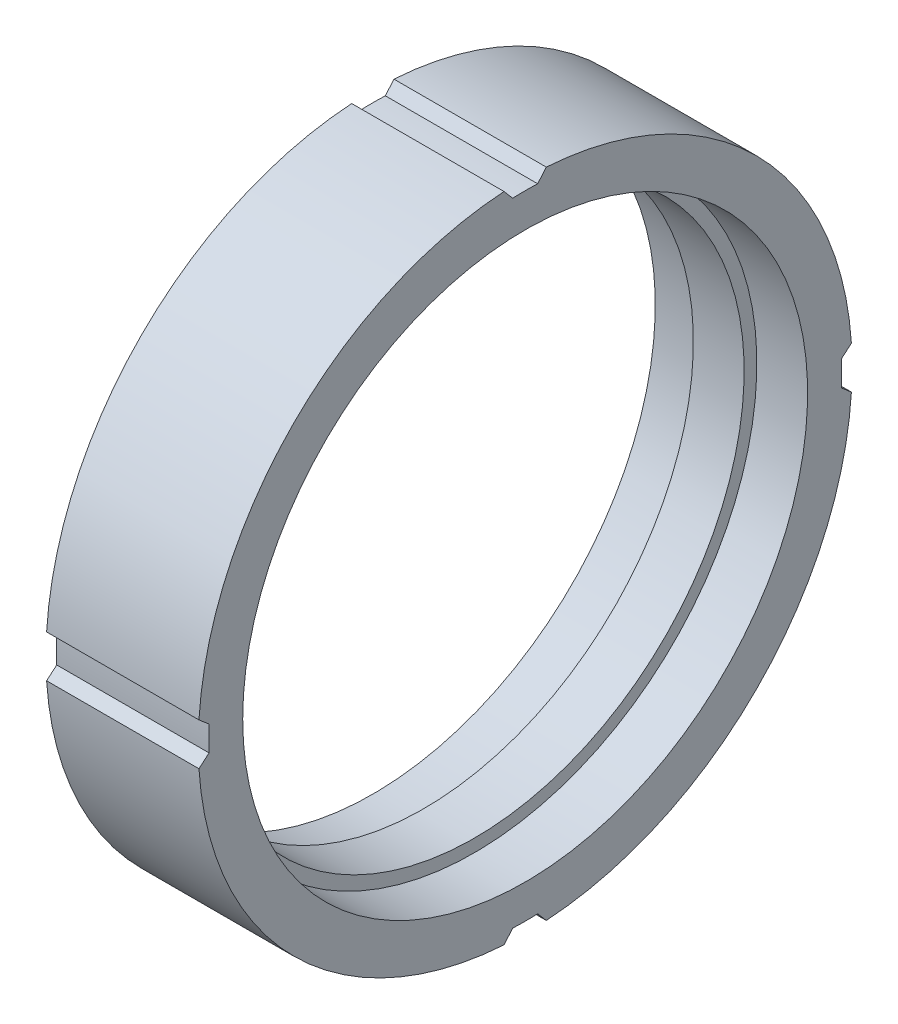
ISO-10303-21;
HEADER;
FILE_DESCRIPTION(('STEP AP214'),'2;1');
FILE_NAME('part.step','',(''),(''),'','','');
FILE_SCHEMA(('AUTOMOTIVE_DESIGN { 1 0 10303 214 1 1 1 1 }'));
ENDSEC;
DATA;
#1=APPLICATION_CONTEXT('core data for automotive mechanical design processes');
#2=APPLICATION_PROTOCOL_DEFINITION('international standard','automotive_design',2000,#1);
#3=PRODUCT_CONTEXT('',#1,'mechanical');
#4=PRODUCT('Part','Part','',(#3));
#5=PRODUCT_RELATED_PRODUCT_CATEGORY('part','',(#4));
#6=PRODUCT_DEFINITION_FORMATION('','',#4);
#7=PRODUCT_DEFINITION_CONTEXT('part definition',#1,'design');
#8=PRODUCT_DEFINITION('design','',#6,#7);
#9=PRODUCT_DEFINITION_SHAPE('','',#8);
#10=(LENGTH_UNIT() NAMED_UNIT(*) SI_UNIT(.MILLI.,.METRE.));
#11=(NAMED_UNIT(*) PLANE_ANGLE_UNIT() SI_UNIT($,.RADIAN.));
#12=(NAMED_UNIT(*) SI_UNIT($,.STERADIAN.) SOLID_ANGLE_UNIT());
#13=UNCERTAINTY_MEASURE_WITH_UNIT(LENGTH_MEASURE(1.E-05),#10,'distance_accuracy_value','');
#14=(GEOMETRIC_REPRESENTATION_CONTEXT(3) GLOBAL_UNCERTAINTY_ASSIGNED_CONTEXT((#13)) GLOBAL_UNIT_ASSIGNED_CONTEXT((#10,
#11,#12)) REPRESENTATION_CONTEXT('',''));
#15=CARTESIAN_POINT('',(0.,0.,0.));
#16=DIRECTION('',(0.,0.,1.));
#17=DIRECTION('',(1.,0.,0.));
#18=AXIS2_PLACEMENT_3D('',#15,#16,#17);
#19=CARTESIAN_POINT('',(-0.622453523883189,0.,0.));
#20=DIRECTION('',(-1.,0.,0.));
#21=DIRECTION('',(0.,0.,1.));
#22=AXIS2_PLACEMENT_3D('',#19,#20,#21);
#23=CYLINDRICAL_SURFACE('',#22,5.15);
#24=CARTESIAN_POINT('',(2.28301092664084,0.,0.));
#25=DIRECTION('',(-1.,0.,0.));
#26=DIRECTION('',(0.,0.,1.));
#27=AXIS2_PLACEMENT_3D('',#24,#25,#26);
#28=CIRCLE('',#27,5.15);
#29=CARTESIAN_POINT('',(2.28301092664084,5.13923066303694,-0.33287864470536));
#30=VERTEX_POINT('',#29);
#31=CARTESIAN_POINT('',(2.28301092664084,0.332878644705256,-5.13923066303696));
#32=VERTEX_POINT('',#31);
#33=EDGE_CURVE('E350',#30,#32,#28,.T.);
#34=ORIENTED_EDGE('',*,*,#33,.T.);
#35=DIRECTION('',(1.,0.,0.));
#36=VECTOR('',#35,1.);
#37=CARTESIAN_POINT('',(-0.116989073359164,0.332878644705256,-5.13923066303696));
#38=LINE('',#37,#36);
#39=CARTESIAN_POINT('',(-0.116989073359164,0.332878644705256,-5.13923066303696));
#40=VERTEX_POINT('',#39);
#41=EDGE_CURVE('E202',#40,#32,#38,.T.);
#42=ORIENTED_EDGE('',*,*,#41,.F.);
#43=CARTESIAN_POINT('',(-0.116989073359164,0.,0.));
#44=DIRECTION('',(-1.,0.,0.));
#45=DIRECTION('',(0.,0.,1.));
#46=AXIS2_PLACEMENT_3D('',#43,#44,#45);
#47=CIRCLE('',#46,5.15);
#48=CARTESIAN_POINT('',(-0.116989073359164,5.13923066303694,-0.33287864470536));
#49=VERTEX_POINT('',#48);
#50=EDGE_CURVE('E348',#49,#40,#47,.T.);
#51=ORIENTED_EDGE('',*,*,#50,.F.);
#52=DIRECTION('',(1.,0.,0.));
#53=VECTOR('',#52,1.);
#54=CARTESIAN_POINT('',(-0.116989073359164,5.13923066303694,-0.33287864470536));
#55=LINE('',#54,#53);
#56=EDGE_CURVE('E236',#49,#30,#55,.T.);
#57=ORIENTED_EDGE('',*,*,#56,.T.);
#58=EDGE_LOOP('',(#34,#42,#51,#57));
#59=FACE_BOUND('',#58,.T.);
#60=ADVANCED_FACE('F50',(#59),#23,.T.);
#61=CARTESIAN_POINT('',(2.28301092664084,0.332878644705326,5.13923066303695));
#62=VERTEX_POINT('',#61);
#63=CARTESIAN_POINT('',(2.28301092664084,5.13923066303695,0.33287864470527));
#64=VERTEX_POINT('',#63);
#65=EDGE_CURVE('E341',#62,#64,#28,.T.);
#66=ORIENTED_EDGE('',*,*,#65,.T.);
#67=DIRECTION('',(1.,0.,0.));
#68=VECTOR('',#67,1.);
#69=CARTESIAN_POINT('',(-0.116989073359164,5.13923066303695,0.33287864470527));
#70=LINE('',#69,#68);
#71=CARTESIAN_POINT('',(-0.116989073359164,5.13923066303695,0.33287864470527));
#72=VERTEX_POINT('',#71);
#73=EDGE_CURVE('E233',#72,#64,#70,.T.);
#74=ORIENTED_EDGE('',*,*,#73,.F.);
#75=CARTESIAN_POINT('',(-0.116989073359164,0.332878644705326,5.13923066303695));
#76=VERTEX_POINT('',#75);
#77=EDGE_CURVE('E59',#76,#72,#47,.T.);
#78=ORIENTED_EDGE('',*,*,#77,.F.);
#79=DIRECTION('',(1.,0.,0.));
#80=VECTOR('',#79,1.);
#81=CARTESIAN_POINT('',(-0.116989073359164,0.332878644705326,5.13923066303695));
#82=LINE('',#81,#80);
#83=EDGE_CURVE('E271',#76,#62,#82,.T.);
#84=ORIENTED_EDGE('',*,*,#83,.T.);
#85=EDGE_LOOP('',(#66,#74,#78,#84));
#86=FACE_BOUND('',#85,.T.);
#87=ADVANCED_FACE('F380',(#86),#23,.T.);
#88=CARTESIAN_POINT('',(2.28301092664084,-5.13923066303694,0.332878644705312));
#89=VERTEX_POINT('',#88);
#90=CARTESIAN_POINT('',(2.28301092664084,-0.332878644705284,5.13923066303693));
#91=VERTEX_POINT('',#90);
#92=EDGE_CURVE('E338',#89,#91,#28,.T.);
#93=ORIENTED_EDGE('',*,*,#92,.T.);
#94=DIRECTION('',(1.,0.,0.));
#95=VECTOR('',#94,1.);
#96=CARTESIAN_POINT('',(-0.116989073359164,-0.332878644705284,5.13923066303693));
#97=LINE('',#96,#95);
#98=CARTESIAN_POINT('',(-0.116989073359164,-0.332878644705284,5.13923066303693));
#99=VERTEX_POINT('',#98);
#100=EDGE_CURVE('E268',#99,#91,#97,.T.);
#101=ORIENTED_EDGE('',*,*,#100,.F.);
#102=CARTESIAN_POINT('',(-0.116989073359164,-5.13923066303694,0.332878644705312));
#103=VERTEX_POINT('',#102);
#104=EDGE_CURVE('E13',#103,#99,#47,.T.);
#105=ORIENTED_EDGE('',*,*,#104,.F.);
#106=DIRECTION('',(1.,0.,0.));
#107=VECTOR('',#106,1.);
#108=CARTESIAN_POINT('',(-0.116989073359164,-5.13923066303694,0.332878644705312));
#109=LINE('',#108,#107);
#110=EDGE_CURVE('E308',#103,#89,#109,.T.);
#111=ORIENTED_EDGE('',*,*,#110,.T.);
#112=EDGE_LOOP('',(#93,#101,#105,#111));
#113=FACE_BOUND('',#112,.T.);
#114=ADVANCED_FACE('F385',(#113),#23,.T.);
#115=CARTESIAN_POINT('',(-0.116989073359164,-4.45000000000002,0.));
#116=DIRECTION('',(1.,0.,0.));
#117=DIRECTION('',(0.,0.,-1.));
#118=AXIS2_PLACEMENT_3D('',#115,#116,#117);
#119=PLANE('',#118);
#120=CARTESIAN_POINT('',(-0.116989073359164,0.,0.));
#121=DIRECTION('',(-1.,0.,0.));
#122=DIRECTION('',(0.,0.,1.));
#123=AXIS2_PLACEMENT_3D('',#120,#121,#122);
#124=CIRCLE('',#123,4.45);
#125=CARTESIAN_POINT('',(-0.116989073359164,0.,4.45));
#126=VERTEX_POINT('',#125);
#127=EDGE_CURVE('E303',#126,#126,#124,.T.);
#128=ORIENTED_EDGE('',*,*,#127,.F.);
#129=EDGE_LOOP('',(#128));
#130=FACE_BOUND('',#129,.T.);
#131=ORIENTED_EDGE('',*,*,#50,.T.);
#132=DIRECTION('',(0.,-0.649237640155618,0.760585620824615));
#133=VECTOR('',#132,1.);
#134=CARTESIAN_POINT('',(-0.116989073359164,0.196837680860956,-4.97985789327843));
#135=LINE('',#134,#133);
#136=CARTESIAN_POINT('',(-0.116989073359164,0.196837680860956,-4.97985789327843));
#137=VERTEX_POINT('',#136);
#138=EDGE_CURVE('E173',#40,#137,#135,.T.);
#139=ORIENTED_EDGE('',*,*,#138,.T.);
#140=CARTESIAN_POINT('',(-0.116989073359164,0.,0.));
#141=DIRECTION('',(-1.,0.,0.));
#142=DIRECTION('',(0.,1.,0.));
#143=AXIS2_PLACEMENT_3D('',#140,#141,#142);
#144=CIRCLE('',#143,4.98374655353321);
#145=CARTESIAN_POINT('',(-0.116989073359164,-0.196837680861067,-4.97985789327841));
#146=VERTEX_POINT('',#145);
#147=EDGE_CURVE('E167',#137,#146,#144,.T.);
#148=ORIENTED_EDGE('',*,*,#147,.T.);
#149=DIRECTION('',(0.,-0.649237640155634,-0.760585620824602));
#150=VECTOR('',#149,1.);
#151=CARTESIAN_POINT('',(-0.116989073359164,-0.196837680861067,-4.97985789327841));
#152=LINE('',#151,#150);
#153=CARTESIAN_POINT('',(-0.116989073359164,-0.332878644705367,-5.13923066303694));
#154=VERTEX_POINT('',#153);
#155=EDGE_CURVE('E176',#146,#154,#152,.T.);
#156=ORIENTED_EDGE('',*,*,#155,.T.);
#157=CARTESIAN_POINT('',(-0.116989073359164,-5.13923066303694,-0.332878644705305));
#158=VERTEX_POINT('',#157);
#159=EDGE_CURVE('E60',#154,#158,#47,.T.);
#160=ORIENTED_EDGE('',*,*,#159,.T.);
#161=DIRECTION('',(0.,0.760585620824608,0.649237640155626));
#162=VECTOR('',#161,1.);
#163=CARTESIAN_POINT('',(-0.116989073359164,-4.97985789327842,-0.196837680861012));
#164=LINE('',#163,#162);
#165=CARTESIAN_POINT('',(-0.116989073359164,-4.97985789327842,-0.196837680861012));
#166=VERTEX_POINT('',#165);
#167=EDGE_CURVE('E287',#158,#166,#164,.T.);
#168=ORIENTED_EDGE('',*,*,#167,.T.);
#169=CARTESIAN_POINT('',(-0.116989073359164,0.,0.));
#170=DIRECTION('',(-1.,0.,0.));
#171=DIRECTION('',(0.,0.,-1.));
#172=AXIS2_PLACEMENT_3D('',#169,#170,#171);
#173=CIRCLE('',#172,4.98374655353321);
#174=CARTESIAN_POINT('',(-0.116989073359164,-4.97985789327843,0.196837680860998));
#175=VERTEX_POINT('',#174);
#176=EDGE_CURVE('E278',#166,#175,#173,.T.);
#177=ORIENTED_EDGE('',*,*,#176,.T.);
#178=DIRECTION('',(0.,-0.760585620824608,0.649237640155626));
#179=VECTOR('',#178,1.);
#180=CARTESIAN_POINT('',(-0.116989073359164,-4.97985789327843,0.196837680860998));
#181=LINE('',#180,#179);
#182=EDGE_CURVE('E282',#175,#103,#181,.T.);
#183=ORIENTED_EDGE('',*,*,#182,.T.);
#184=ORIENTED_EDGE('',*,*,#104,.T.);
#185=DIRECTION('',(0.,0.649237640155623,-0.76058562082461));
#186=VECTOR('',#185,1.);
#187=CARTESIAN_POINT('',(-0.116989073359164,-0.196837680860998,4.97985789327842));
#188=LINE('',#187,#186);
#189=CARTESIAN_POINT('',(-0.116989073359164,-0.196837680860998,4.97985789327842));
#190=VERTEX_POINT('',#189);
#191=EDGE_CURVE('E251',#99,#190,#188,.T.);
#192=ORIENTED_EDGE('',*,*,#191,.T.);
#193=CARTESIAN_POINT('',(-0.116989073359164,0.,0.));
#194=DIRECTION('',(-1.,0.,0.));
#195=DIRECTION('',(0.,-1.,0.));
#196=AXIS2_PLACEMENT_3D('',#193,#194,#195);
#197=CIRCLE('',#196,4.98374655353321);
#198=CARTESIAN_POINT('',(-0.116989073359164,0.196837680861039,4.97985789327842));
#199=VERTEX_POINT('',#198);
#200=EDGE_CURVE('E242',#190,#199,#197,.T.);
#201=ORIENTED_EDGE('',*,*,#200,.T.);
#202=DIRECTION('',(0.,0.649237640155629,0.760585620824606));
#203=VECTOR('',#202,1.);
#204=CARTESIAN_POINT('',(-0.116989073359164,0.196837680861039,4.97985789327842));
#205=LINE('',#204,#203);
#206=EDGE_CURVE('E246',#199,#76,#205,.T.);
#207=ORIENTED_EDGE('',*,*,#206,.T.);
#208=ORIENTED_EDGE('',*,*,#77,.T.);
#209=DIRECTION('',(0.,-0.760585620824613,-0.649237640155621));
#210=VECTOR('',#209,1.);
#211=CARTESIAN_POINT('',(-0.116989073359164,4.97985789327844,0.196837680860977));
#212=LINE('',#211,#210);
#213=CARTESIAN_POINT('',(-0.116989073359164,4.97985789327844,0.196837680860977));
#214=VERTEX_POINT('',#213);
#215=EDGE_CURVE('E216',#72,#214,#212,.T.);
#216=ORIENTED_EDGE('',*,*,#215,.T.);
#217=CARTESIAN_POINT('',(-0.116989073359164,0.,0.));
#218=DIRECTION('',(-1.,0.,0.));
#219=DIRECTION('',(0.,0.,1.));
#220=AXIS2_PLACEMENT_3D('',#217,#218,#219);
#221=CIRCLE('',#220,4.98374655353321);
#222=CARTESIAN_POINT('',(-0.116989073359164,4.97985789327841,-0.196837680861046));
#223=VERTEX_POINT('',#222);
#224=EDGE_CURVE('E207',#214,#223,#221,.T.);
#225=ORIENTED_EDGE('',*,*,#224,.T.);
#226=DIRECTION('',(0.,0.760585620824604,-0.649237640155631));
#227=VECTOR('',#226,1.);
#228=CARTESIAN_POINT('',(-0.116989073359164,4.97985789327841,-0.196837680861046));
#229=LINE('',#228,#227);
#230=EDGE_CURVE('E211',#223,#49,#229,.T.);
#231=ORIENTED_EDGE('',*,*,#230,.T.);
#232=EDGE_LOOP('',(#131,#139,#148,#156,#160,#168,#177,#183,#184,#192,#201,#207,#208,#216,#225,#231));
#233=FACE_BOUND('',#232,.T.);
#234=ADVANCED_FACE('F52',(#130,#233),#119,.F.);
#235=ORIENTED_EDGE('',*,*,#159,.F.);
#236=DIRECTION('',(1.,0.,0.));
#237=VECTOR('',#236,1.);
#238=CARTESIAN_POINT('',(-0.116989073359164,-0.332878644705367,-5.13923066303694));
#239=LINE('',#238,#237);
#240=CARTESIAN_POINT('',(2.28301092664084,-0.332878644705367,-5.13923066303694));
#241=VERTEX_POINT('',#240);
#242=EDGE_CURVE('E172',#154,#241,#239,.T.);
#243=ORIENTED_EDGE('',*,*,#242,.T.);
#244=CARTESIAN_POINT('',(2.28301092664084,-5.13923066303694,-0.332878644705305));
#245=VERTEX_POINT('',#244);
#246=EDGE_CURVE('E337',#241,#245,#28,.T.);
#247=ORIENTED_EDGE('',*,*,#246,.T.);
#248=DIRECTION('',(1.,0.,0.));
#249=VECTOR('',#248,1.);
#250=CARTESIAN_POINT('',(-0.116989073359164,-5.13923066303694,-0.332878644705305));
#251=LINE('',#250,#249);
#252=EDGE_CURVE('E304',#158,#245,#251,.T.);
#253=ORIENTED_EDGE('',*,*,#252,.F.);
#254=EDGE_LOOP('',(#235,#243,#247,#253));
#255=FACE_BOUND('',#254,.T.);
#256=ADVANCED_FACE('F381',(#255),#23,.T.);
#257=CARTESIAN_POINT('',(2.28301092664084,-5.15,0.));
#258=DIRECTION('',(-1.,0.,0.));
#259=DIRECTION('',(0.,0.,1.));
#260=AXIS2_PLACEMENT_3D('',#257,#258,#259);
#261=PLANE('',#260);
#262=CARTESIAN_POINT('',(2.28301092664084,0.,0.));
#263=DIRECTION('',(-1.,0.,0.));
#264=DIRECTION('',(0.,1.,0.));
#265=AXIS2_PLACEMENT_3D('',#262,#263,#264);
#266=CIRCLE('',#265,4.98374655353321);
#267=CARTESIAN_POINT('',(2.28301092664084,0.196837680860956,-4.97985789327843));
#268=VERTEX_POINT('',#267);
#269=CARTESIAN_POINT('',(2.28301092664084,-0.196837680861067,-4.97985789327841));
#270=VERTEX_POINT('',#269);
#271=EDGE_CURVE('E67',#268,#270,#266,.T.);
#272=ORIENTED_EDGE('',*,*,#271,.F.);
#273=DIRECTION('',(0.,-0.649237640155618,0.760585620824615));
#274=VECTOR('',#273,1.);
#275=CARTESIAN_POINT('',(2.28301092664084,0.196837680860956,-4.97985789327843));
#276=LINE('',#275,#274);
#277=EDGE_CURVE('E185',#32,#268,#276,.T.);
#278=ORIENTED_EDGE('',*,*,#277,.F.);
#279=ORIENTED_EDGE('',*,*,#33,.F.);
#280=DIRECTION('',(0.,0.760585620824604,-0.649237640155631));
#281=VECTOR('',#280,1.);
#282=CARTESIAN_POINT('',(2.28301092664084,4.97985789327841,-0.196837680861046));
#283=LINE('',#282,#281);
#284=CARTESIAN_POINT('',(2.28301092664084,4.97985789327841,-0.19683768086106));
#285=VERTEX_POINT('',#284);
#286=EDGE_CURVE('E223',#285,#30,#283,.T.);
#287=ORIENTED_EDGE('',*,*,#286,.F.);
#288=CARTESIAN_POINT('',(2.28301092664084,0.,0.));
#289=DIRECTION('',(-1.,0.,0.));
#290=DIRECTION('',(0.,0.,1.));
#291=AXIS2_PLACEMENT_3D('',#288,#289,#290);
#292=CIRCLE('',#291,4.98374655353321);
#293=CARTESIAN_POINT('',(2.28301092664084,4.97985789327843,0.196837680860977));
#294=VERTEX_POINT('',#293);
#295=EDGE_CURVE('E75',#294,#285,#292,.T.);
#296=ORIENTED_EDGE('',*,*,#295,.F.);
#297=DIRECTION('',(0.,-0.760585620824613,-0.649237640155621));
#298=VECTOR('',#297,1.);
#299=CARTESIAN_POINT('',(2.28301092664084,4.97985789327843,0.196837680860977));
#300=LINE('',#299,#298);
#301=EDGE_CURVE('E212',#64,#294,#300,.T.);
#302=ORIENTED_EDGE('',*,*,#301,.F.);
#303=ORIENTED_EDGE('',*,*,#65,.F.);
#304=DIRECTION('',(0.,0.649237640155629,0.760585620824606));
#305=VECTOR('',#304,1.);
#306=CARTESIAN_POINT('',(2.28301092664084,0.196837680861026,4.97985789327842));
#307=LINE('',#306,#305);
#308=CARTESIAN_POINT('',(2.28301092664084,0.196837680861039,4.97985789327842));
#309=VERTEX_POINT('',#308);
#310=EDGE_CURVE('E258',#309,#62,#307,.T.);
#311=ORIENTED_EDGE('',*,*,#310,.F.);
#312=CARTESIAN_POINT('',(2.28301092664084,0.,0.));
#313=DIRECTION('',(-1.,0.,0.));
#314=DIRECTION('',(0.,-1.,0.));
#315=AXIS2_PLACEMENT_3D('',#312,#313,#314);
#316=CIRCLE('',#315,4.98374655353321);
#317=CARTESIAN_POINT('',(2.28301092664084,-0.196837680860998,4.97985789327842));
#318=VERTEX_POINT('',#317);
#319=EDGE_CURVE('E232',#318,#309,#316,.T.);
#320=ORIENTED_EDGE('',*,*,#319,.F.);
#321=DIRECTION('',(0.,0.649237640155623,-0.76058562082461));
#322=VECTOR('',#321,1.);
#323=CARTESIAN_POINT('',(2.28301092664084,-0.196837680860998,4.97985789327842));
#324=LINE('',#323,#322);
#325=EDGE_CURVE('E247',#91,#318,#324,.T.);
#326=ORIENTED_EDGE('',*,*,#325,.F.);
#327=ORIENTED_EDGE('',*,*,#92,.F.);
#328=DIRECTION('',(0.,-0.760585620824608,0.649237640155626));
#329=VECTOR('',#328,1.);
#330=CARTESIAN_POINT('',(2.28301092664084,-4.97985789327843,0.196837680860998));
#331=LINE('',#330,#329);
#332=CARTESIAN_POINT('',(2.28301092664084,-4.97985789327843,0.196837680860998));
#333=VERTEX_POINT('',#332);
#334=EDGE_CURVE('E294',#333,#89,#331,.T.);
#335=ORIENTED_EDGE('',*,*,#334,.F.);
#336=CARTESIAN_POINT('',(2.28301092664084,0.,0.));
#337=DIRECTION('',(-1.,0.,0.));
#338=DIRECTION('',(0.,0.,-1.));
#339=AXIS2_PLACEMENT_3D('',#336,#337,#338);
#340=CIRCLE('',#339,4.98374655353321);
#341=CARTESIAN_POINT('',(2.28301092664084,-4.97985789327842,-0.196837680861012));
#342=VERTEX_POINT('',#341);
#343=EDGE_CURVE('E267',#342,#333,#340,.T.);
#344=ORIENTED_EDGE('',*,*,#343,.F.);
#345=DIRECTION('',(0.,0.760585620824608,0.649237640155626));
#346=VECTOR('',#345,1.);
#347=CARTESIAN_POINT('',(2.28301092664084,-4.97985789327842,-0.196837680861012));
#348=LINE('',#347,#346);
#349=EDGE_CURVE('E283',#245,#342,#348,.T.);
#350=ORIENTED_EDGE('',*,*,#349,.F.);
#351=ORIENTED_EDGE('',*,*,#246,.F.);
#352=DIRECTION('',(0.,-0.649237640155634,-0.760585620824602));
#353=VECTOR('',#352,1.);
#354=CARTESIAN_POINT('',(2.28301092664084,-0.196837680861067,-4.97985789327841));
#355=LINE('',#354,#353);
#356=EDGE_CURVE('E190',#270,#241,#355,.T.);
#357=ORIENTED_EDGE('',*,*,#356,.F.);
#358=EDGE_LOOP('',(#272,#278,#279,#287,#296,#302,#303,#311,#320,#326,#327,#335,#344,#350,#351,#357));
#359=FACE_BOUND('',#358,.T.);
#360=CARTESIAN_POINT('',(2.28301092664084,0.,0.));
#361=DIRECTION('',(-1.,0.,0.));
#362=DIRECTION('',(0.,0.,1.));
#363=AXIS2_PLACEMENT_3D('',#360,#361,#362);
#364=CIRCLE('',#363,4.45);
#365=CARTESIAN_POINT('',(2.28301092664084,0.,4.45));
#366=VERTEX_POINT('',#365);
#367=EDGE_CURVE('E334',#366,#366,#364,.T.);
#368=ORIENTED_EDGE('',*,*,#367,.T.);
#369=EDGE_LOOP('',(#368));
#370=FACE_BOUND('',#369,.T.);
#371=ADVANCED_FACE('F366',(#359,#370),#261,.F.);
#372=CARTESIAN_POINT('',(-0.622453523883189,0.,0.));
#373=DIRECTION('',(-1.,0.,0.));
#374=DIRECTION('',(0.,0.,1.));
#375=AXIS2_PLACEMENT_3D('',#372,#373,#374);
#376=CYLINDRICAL_SURFACE('',#375,4.45);
#377=ORIENTED_EDGE('',*,*,#367,.F.);
#378=EDGE_LOOP('',(#377));
#379=FACE_BOUND('',#378,.T.);
#380=CARTESIAN_POINT('',(1.48301092664083,0.,0.));
#381=DIRECTION('',(-1.,0.,0.));
#382=DIRECTION('',(0.,0.,1.));
#383=AXIS2_PLACEMENT_3D('',#380,#381,#382);
#384=CIRCLE('',#383,4.45);
#385=CARTESIAN_POINT('',(1.48301092664083,0.,4.45));
#386=VERTEX_POINT('',#385);
#387=EDGE_CURVE('E330',#386,#386,#384,.T.);
#388=ORIENTED_EDGE('',*,*,#387,.T.);
#389=EDGE_LOOP('',(#388));
#390=FACE_BOUND('',#389,.T.);
#391=ADVANCED_FACE('F393',(#379,#390),#376,.F.);
#392=CARTESIAN_POINT('',(1.48301092664083,-4.45000000000002,0.));
#393=DIRECTION('',(-1.,0.,0.));
#394=DIRECTION('',(0.,0.,1.));
#395=AXIS2_PLACEMENT_3D('',#392,#393,#394);
#396=PLANE('',#395);
#397=ORIENTED_EDGE('',*,*,#387,.F.);
#398=EDGE_LOOP('',(#397));
#399=FACE_BOUND('',#398,.T.);
#400=CARTESIAN_POINT('',(1.48301092664083,0.,0.));
#401=DIRECTION('',(-1.,0.,0.));
#402=DIRECTION('',(0.,0.,1.));
#403=AXIS2_PLACEMENT_3D('',#400,#401,#402);
#404=CIRCLE('',#403,4.25);
#405=CARTESIAN_POINT('',(1.48301092664083,0.,4.25));
#406=VERTEX_POINT('',#405);
#407=EDGE_CURVE('E326',#406,#406,#404,.T.);
#408=ORIENTED_EDGE('',*,*,#407,.T.);
#409=EDGE_LOOP('',(#408));
#410=FACE_BOUND('',#409,.T.);
#411=ADVANCED_FACE('F423',(#399,#410),#396,.F.);
#412=CARTESIAN_POINT('',(-0.622453523883189,0.,0.));
#413=DIRECTION('',(-1.,0.,0.));
#414=DIRECTION('',(0.,0.,1.));
#415=AXIS2_PLACEMENT_3D('',#412,#413,#414);
#416=CYLINDRICAL_SURFACE('',#415,4.25);
#417=ORIENTED_EDGE('',*,*,#407,.F.);
#418=EDGE_LOOP('',(#417));
#419=FACE_BOUND('',#418,.T.);
#420=CARTESIAN_POINT('',(0.683010926640838,0.,0.));
#421=DIRECTION('',(-1.,0.,0.));
#422=DIRECTION('',(0.,0.,1.));
#423=AXIS2_PLACEMENT_3D('',#420,#421,#422);
#424=CIRCLE('',#423,4.25);
#425=CARTESIAN_POINT('',(0.683010926640838,0.,4.25));
#426=VERTEX_POINT('',#425);
#427=EDGE_CURVE('E322',#426,#426,#424,.T.);
#428=ORIENTED_EDGE('',*,*,#427,.T.);
#429=EDGE_LOOP('',(#428));
#430=FACE_BOUND('',#429,.T.);
#431=ADVANCED_FACE('F433',(#419,#430),#416,.F.);
#432=CARTESIAN_POINT('',(0.683010926640838,-4.25,0.));
#433=DIRECTION('',(1.,0.,0.));
#434=DIRECTION('',(0.,0.,-1.));
#435=AXIS2_PLACEMENT_3D('',#432,#433,#434);
#436=PLANE('',#435);
#437=ORIENTED_EDGE('',*,*,#427,.F.);
#438=EDGE_LOOP('',(#437));
#439=FACE_BOUND('',#438,.T.);
#440=CARTESIAN_POINT('',(0.683010926640838,0.,0.));
#441=DIRECTION('',(-1.,0.,0.));
#442=DIRECTION('',(0.,0.,1.));
#443=AXIS2_PLACEMENT_3D('',#440,#441,#442);
#444=CIRCLE('',#443,4.45);
#445=CARTESIAN_POINT('',(0.683010926640838,0.,4.45));
#446=VERTEX_POINT('',#445);
#447=EDGE_CURVE('E318',#446,#446,#444,.T.);
#448=ORIENTED_EDGE('',*,*,#447,.T.);
#449=EDGE_LOOP('',(#448));
#450=FACE_BOUND('',#449,.T.);
#451=ADVANCED_FACE('F443',(#439,#450),#436,.F.);
#452=CARTESIAN_POINT('',(-0.622453523883189,0.,0.));
#453=DIRECTION('',(-1.,0.,0.));
#454=DIRECTION('',(0.,0.,1.));
#455=AXIS2_PLACEMENT_3D('',#452,#453,#454);
#456=CYLINDRICAL_SURFACE('',#455,4.45);
#457=ORIENTED_EDGE('',*,*,#447,.F.);
#458=EDGE_LOOP('',(#457));
#459=FACE_BOUND('',#458,.T.);
#460=ORIENTED_EDGE('',*,*,#127,.T.);
#461=EDGE_LOOP('',(#460));
#462=FACE_BOUND('',#461,.T.);
#463=ADVANCED_FACE('F453',(#459,#462),#456,.F.);
#464=CARTESIAN_POINT('',(-0.116989073359164,0.,0.));
#465=DIRECTION('',(1.,0.,0.));
#466=DIRECTION('',(0.,0.,-1.));
#467=AXIS2_PLACEMENT_3D('',#464,#465,#466);
#468=CYLINDRICAL_SURFACE('',#467,4.98374655353321);
#469=ORIENTED_EDGE('',*,*,#343,.T.);
#470=DIRECTION('',(1.,0.,0.));
#471=VECTOR('',#470,1.);
#472=CARTESIAN_POINT('',(-0.116989073359164,-4.97985789327843,0.196837680860998));
#473=LINE('',#472,#471);
#474=EDGE_CURVE('E291',#175,#333,#473,.T.);
#475=ORIENTED_EDGE('',*,*,#474,.F.);
#476=ORIENTED_EDGE('',*,*,#176,.F.);
#477=DIRECTION('',(1.,0.,0.));
#478=VECTOR('',#477,1.);
#479=CARTESIAN_POINT('',(-0.116989073359164,-4.97985789327842,-0.196837680861012));
#480=LINE('',#479,#478);
#481=EDGE_CURVE('E300',#166,#342,#480,.T.);
#482=ORIENTED_EDGE('',*,*,#481,.T.);
#483=EDGE_LOOP('',(#469,#475,#476,#482));
#484=FACE_BOUND('',#483,.T.);
#485=ADVANCED_FACE('F463',(#484),#468,.T.);
#486=CARTESIAN_POINT('',(-0.116989073359164,-4.97985789327842,-0.196837680861012));
#487=DIRECTION('',(0.,0.649237640155626,-0.760585620824608));
#488=DIRECTION('',(0.,0.760585620824608,0.649237640155626));
#489=AXIS2_PLACEMENT_3D('',#486,#487,#488);
#490=PLANE('',#489);
#491=ORIENTED_EDGE('',*,*,#349,.T.);
#492=ORIENTED_EDGE('',*,*,#481,.F.);
#493=ORIENTED_EDGE('',*,*,#167,.F.);
#494=ORIENTED_EDGE('',*,*,#252,.T.);
#495=EDGE_LOOP('',(#491,#492,#493,#494));
#496=FACE_BOUND('',#495,.T.);
#497=ADVANCED_FACE('F473',(#496),#490,.F.);
#498=CARTESIAN_POINT('',(-0.116989073359164,-4.97985789327843,0.196837680860998));
#499=DIRECTION('',(0.,0.649237640155626,0.760585620824608));
#500=DIRECTION('',(0.,-0.760585620824608,0.649237640155626));
#501=AXIS2_PLACEMENT_3D('',#498,#499,#500);
#502=PLANE('',#501);
#503=ORIENTED_EDGE('',*,*,#334,.T.);
#504=ORIENTED_EDGE('',*,*,#110,.F.);
#505=ORIENTED_EDGE('',*,*,#182,.F.);
#506=ORIENTED_EDGE('',*,*,#474,.T.);
#507=EDGE_LOOP('',(#503,#504,#505,#506));
#508=FACE_BOUND('',#507,.T.);
#509=ADVANCED_FACE('F483',(#508),#502,.F.);
#510=CARTESIAN_POINT('',(-0.116989073359164,0.,0.));
#511=DIRECTION('',(1.,0.,0.));
#512=DIRECTION('',(0.,1.,0.));
#513=AXIS2_PLACEMENT_3D('',#510,#511,#512);
#514=CYLINDRICAL_SURFACE('',#513,4.98374655353321);
#515=ORIENTED_EDGE('',*,*,#319,.T.);
#516=DIRECTION('',(1.,0.,0.));
#517=VECTOR('',#516,1.);
#518=CARTESIAN_POINT('',(-0.116989073359164,0.196837680861039,4.97985789327842));
#519=LINE('',#518,#517);
#520=EDGE_CURVE('E255',#199,#309,#519,.T.);
#521=ORIENTED_EDGE('',*,*,#520,.F.);
#522=ORIENTED_EDGE('',*,*,#200,.F.);
#523=DIRECTION('',(1.,0.,0.));
#524=VECTOR('',#523,1.);
#525=CARTESIAN_POINT('',(-0.116989073359164,-0.196837680860998,4.97985789327842));
#526=LINE('',#525,#524);
#527=EDGE_CURVE('E264',#190,#318,#526,.T.);
#528=ORIENTED_EDGE('',*,*,#527,.T.);
#529=EDGE_LOOP('',(#515,#521,#522,#528));
#530=FACE_BOUND('',#529,.T.);
#531=ADVANCED_FACE('F493',(#530),#514,.T.);
#532=CARTESIAN_POINT('',(-0.116989073359164,-0.196837680860998,4.97985789327842));
#533=DIRECTION('',(0.,-0.76058562082461,-0.649237640155623));
#534=DIRECTION('',(0.,0.649237640155623,-0.76058562082461));
#535=AXIS2_PLACEMENT_3D('',#532,#533,#534);
#536=PLANE('',#535);
#537=ORIENTED_EDGE('',*,*,#325,.T.);
#538=ORIENTED_EDGE('',*,*,#527,.F.);
#539=ORIENTED_EDGE('',*,*,#191,.F.);
#540=ORIENTED_EDGE('',*,*,#100,.T.);
#541=EDGE_LOOP('',(#537,#538,#539,#540));
#542=FACE_BOUND('',#541,.T.);
#543=ADVANCED_FACE('F503',(#542),#536,.F.);
#544=CARTESIAN_POINT('',(-0.116989073359164,0.196837680861039,4.97985789327842));
#545=DIRECTION('',(0.,0.760585620824606,-0.649237640155629));
#546=DIRECTION('',(0.,0.649237640155628,0.760585620824606));
#547=AXIS2_PLACEMENT_3D('',#544,#545,#546);
#548=PLANE('',#547);
#549=ORIENTED_EDGE('',*,*,#310,.T.);
#550=ORIENTED_EDGE('',*,*,#83,.F.);
#551=ORIENTED_EDGE('',*,*,#206,.F.);
#552=ORIENTED_EDGE('',*,*,#520,.T.);
#553=EDGE_LOOP('',(#549,#550,#551,#552));
#554=FACE_BOUND('',#553,.T.);
#555=ADVANCED_FACE('F514',(#554),#548,.F.);
#556=CARTESIAN_POINT('',(-0.116989073359164,0.,0.));
#557=DIRECTION('',(1.,0.,0.));
#558=DIRECTION('',(0.,0.,-1.));
#559=AXIS2_PLACEMENT_3D('',#556,#557,#558);
#560=CYLINDRICAL_SURFACE('',#559,4.98374655353321);
#561=ORIENTED_EDGE('',*,*,#295,.T.);
#562=DIRECTION('',(1.,0.,0.));
#563=VECTOR('',#562,1.);
#564=CARTESIAN_POINT('',(-0.116989073359164,4.97985789327841,-0.196837680861046));
#565=LINE('',#564,#563);
#566=EDGE_CURVE('E220',#223,#285,#565,.T.);
#567=ORIENTED_EDGE('',*,*,#566,.F.);
#568=ORIENTED_EDGE('',*,*,#224,.F.);
#569=DIRECTION('',(1.,0.,0.));
#570=VECTOR('',#569,1.);
#571=CARTESIAN_POINT('',(-0.116989073359164,4.97985789327844,0.196837680860977));
#572=LINE('',#571,#570);
#573=EDGE_CURVE('E229',#214,#294,#572,.T.);
#574=ORIENTED_EDGE('',*,*,#573,.T.);
#575=EDGE_LOOP('',(#561,#567,#568,#574));
#576=FACE_BOUND('',#575,.T.);
#577=ADVANCED_FACE('F524',(#576),#560,.T.);
#578=CARTESIAN_POINT('',(-0.116989073359164,4.97985789327844,0.196837680860977));
#579=DIRECTION('',(0.,-0.649237640155621,0.760585620824613));
#580=DIRECTION('',(0.,-0.760585620824613,-0.649237640155621));
#581=AXIS2_PLACEMENT_3D('',#578,#579,#580);
#582=PLANE('',#581);
#583=ORIENTED_EDGE('',*,*,#301,.T.);
#584=ORIENTED_EDGE('',*,*,#573,.F.);
#585=ORIENTED_EDGE('',*,*,#215,.F.);
#586=ORIENTED_EDGE('',*,*,#73,.T.);
#587=EDGE_LOOP('',(#583,#584,#585,#586));
#588=FACE_BOUND('',#587,.T.);
#589=ADVANCED_FACE('F534',(#588),#582,.F.);
#590=CARTESIAN_POINT('',(-0.116989073359164,4.97985789327841,-0.196837680861046));
#591=DIRECTION('',(0.,-0.649237640155631,-0.760585620824604));
#592=DIRECTION('',(0.,0.760585620824604,-0.649237640155631));
#593=AXIS2_PLACEMENT_3D('',#590,#591,#592);
#594=PLANE('',#593);
#595=ORIENTED_EDGE('',*,*,#286,.T.);
#596=ORIENTED_EDGE('',*,*,#56,.F.);
#597=ORIENTED_EDGE('',*,*,#230,.F.);
#598=ORIENTED_EDGE('',*,*,#566,.T.);
#599=EDGE_LOOP('',(#595,#596,#597,#598));
#600=FACE_BOUND('',#599,.T.);
#601=ADVANCED_FACE('F377',(#600),#594,.F.);
#602=CARTESIAN_POINT('',(-0.116989073359164,0.,0.));
#603=DIRECTION('',(1.,0.,0.));
#604=DIRECTION('',(0.,1.,0.));
#605=AXIS2_PLACEMENT_3D('',#602,#603,#604);
#606=CYLINDRICAL_SURFACE('',#605,4.98374655353321);
#607=ORIENTED_EDGE('',*,*,#271,.T.);
#608=DIRECTION('',(1.,0.,0.));
#609=VECTOR('',#608,1.);
#610=CARTESIAN_POINT('',(-0.116989073359164,-0.196837680861067,-4.97985789327841));
#611=LINE('',#610,#609);
#612=EDGE_CURVE('E163',#146,#270,#611,.T.);
#613=ORIENTED_EDGE('',*,*,#612,.F.);
#614=ORIENTED_EDGE('',*,*,#147,.F.);
#615=DIRECTION('',(1.,0.,0.));
#616=VECTOR('',#615,1.);
#617=CARTESIAN_POINT('',(-0.116989073359164,0.196837680860956,-4.97985789327843));
#618=LINE('',#617,#616);
#619=EDGE_CURVE('E199',#137,#268,#618,.T.);
#620=ORIENTED_EDGE('',*,*,#619,.T.);
#621=EDGE_LOOP('',(#607,#613,#614,#620));
#622=FACE_BOUND('',#621,.T.);
#623=ADVANCED_FACE('F165',(#622),#606,.T.);
#624=CARTESIAN_POINT('',(-0.116989073359164,0.196837680860956,-4.97985789327843));
#625=DIRECTION('',(0.,0.760585620824615,0.649237640155618));
#626=DIRECTION('',(0.,-0.649237640155618,0.760585620824615));
#627=AXIS2_PLACEMENT_3D('',#624,#625,#626);
#628=PLANE('',#627);
#629=ORIENTED_EDGE('',*,*,#277,.T.);
#630=ORIENTED_EDGE('',*,*,#619,.F.);
#631=ORIENTED_EDGE('',*,*,#138,.F.);
#632=ORIENTED_EDGE('',*,*,#41,.T.);
#633=EDGE_LOOP('',(#629,#630,#631,#632));
#634=FACE_BOUND('',#633,.T.);
#635=ADVANCED_FACE('F369',(#634),#628,.F.);
#636=CARTESIAN_POINT('',(-0.116989073359164,-0.196837680861067,-4.97985789327841));
#637=DIRECTION('',(0.,-0.760585620824602,0.649237640155634));
#638=DIRECTION('',(0.,-0.649237640155634,-0.760585620824602));
#639=AXIS2_PLACEMENT_3D('',#636,#637,#638);
#640=PLANE('',#639);
#641=ORIENTED_EDGE('',*,*,#356,.T.);
#642=ORIENTED_EDGE('',*,*,#242,.F.);
#643=ORIENTED_EDGE('',*,*,#155,.F.);
#644=ORIENTED_EDGE('',*,*,#612,.T.);
#645=EDGE_LOOP('',(#641,#642,#643,#644));
#646=FACE_BOUND('',#645,.T.);
#647=ADVANCED_FACE('F177',(#646),#640,.F.);
#648=CLOSED_SHELL('',(#60,#87,#114,#234,#256,#371,#391,#411,#431,#451,#463,#485,#497,#509,#531,
#543,#555,#577,#589,#601,#623,#635,#647));
#649=MANIFOLD_SOLID_BREP('B2',#648);
#650=ADVANCED_BREP_SHAPE_REPRESENTATION('',(#18,#649),#14);
#651=SHAPE_DEFINITION_REPRESENTATION(#9,#650);
ENDSEC;
END-ISO-10303-21;
